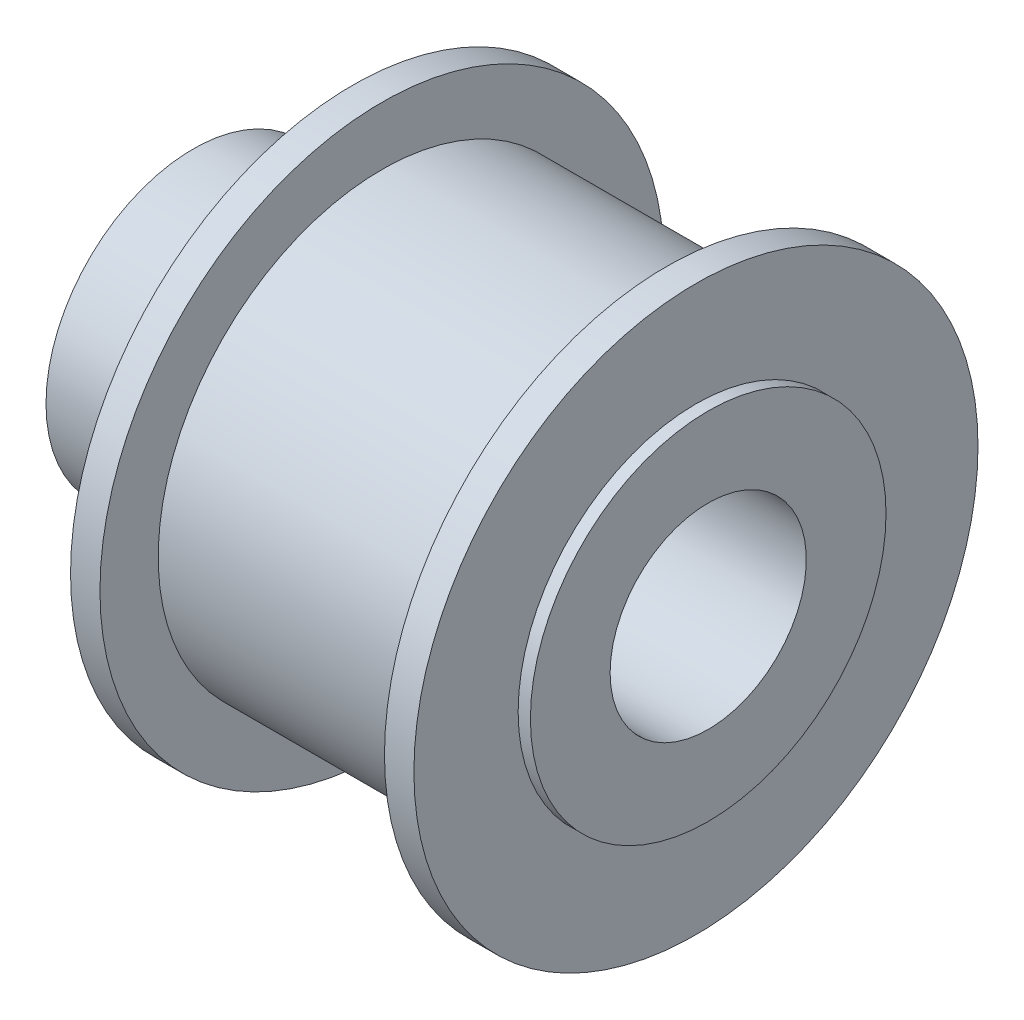
ISO-10303-21;
HEADER;
FILE_DESCRIPTION(('STEP AP214'),'2;1');
FILE_NAME('part.step','',(''),(''),'','','');
FILE_SCHEMA(('AUTOMOTIVE_DESIGN { 1 0 10303 214 1 1 1 1 }'));
ENDSEC;
DATA;
#1=APPLICATION_CONTEXT('core data for automotive mechanical design processes');
#2=APPLICATION_PROTOCOL_DEFINITION('international standard','automotive_design',2000,#1);
#3=PRODUCT_CONTEXT('',#1,'mechanical');
#4=PRODUCT('Part','Part','',(#3));
#5=PRODUCT_RELATED_PRODUCT_CATEGORY('part','',(#4));
#6=PRODUCT_DEFINITION_FORMATION('','',#4);
#7=PRODUCT_DEFINITION_CONTEXT('part definition',#1,'design');
#8=PRODUCT_DEFINITION('design','',#6,#7);
#9=PRODUCT_DEFINITION_SHAPE('','',#8);
#10=(LENGTH_UNIT() NAMED_UNIT(*) SI_UNIT(.MILLI.,.METRE.));
#11=(NAMED_UNIT(*) PLANE_ANGLE_UNIT() SI_UNIT($,.RADIAN.));
#12=(NAMED_UNIT(*) SI_UNIT($,.STERADIAN.) SOLID_ANGLE_UNIT());
#13=UNCERTAINTY_MEASURE_WITH_UNIT(LENGTH_MEASURE(1.E-05),#10,'distance_accuracy_value','');
#14=(GEOMETRIC_REPRESENTATION_CONTEXT(3) GLOBAL_UNCERTAINTY_ASSIGNED_CONTEXT((#13)) GLOBAL_UNIT_ASSIGNED_CONTEXT((#10,
#11,#12)) REPRESENTATION_CONTEXT('',''));
#15=CARTESIAN_POINT('',(0.,0.,0.));
#16=DIRECTION('',(0.,0.,1.));
#17=DIRECTION('',(1.,0.,0.));
#18=AXIS2_PLACEMENT_3D('',#15,#16,#17);
#19=CARTESIAN_POINT('',(6.,0.,0.));
#20=DIRECTION('',(-1.,0.,0.));
#21=DIRECTION('',(0.,0.,1.));
#22=AXIS2_PLACEMENT_3D('',#19,#20,#21);
#23=CYLINDRICAL_SURFACE('',#22,6.);
#24=CARTESIAN_POINT('',(2.25000000000001,0.,-6.));
#25=CARTESIAN_POINT('',(2.25000247746924,-0.06940904170166,-5.99999871526651));
#26=CARTESIAN_POINT('',(2.25580066571876,-0.138848789520874,-5.99878328775043));
#27=CARTESIAN_POINT('',(2.27881934953286,-0.275761316266991,-5.99405200990679));
#28=CARTESIAN_POINT('',(2.29604852303694,-0.343232560128309,-5.99053441189248));
#29=CARTESIAN_POINT('',(2.34137045492183,-0.474209132291338,-5.98159109196201));
#30=CARTESIAN_POINT('',(2.3694523959989,-0.53771833670918,-5.97616727052645));
#31=CARTESIAN_POINT('',(2.43564960885619,-0.659120328605952,-5.96399927809858));
#32=CARTESIAN_POINT('',(2.47376443115584,-0.71701336753432,-5.95725516625975));
#33=CARTESIAN_POINT('',(2.55953634019065,-0.826390324308829,-5.9430770002465));
#34=CARTESIAN_POINT('',(2.60731200123509,-0.877780244162677,-5.93563505848531));
#35=CARTESIAN_POINT('',(2.71079465919512,-0.971877776769383,-5.92095657692448));
#36=CARTESIAN_POINT('',(2.76650231187227,-1.01458467096098,-5.91372005416683));
#37=CARTESIAN_POINT('',(2.88495196876617,-1.09051031677216,-5.90019442595308));
#38=CARTESIAN_POINT('',(2.94775838450275,-1.1236305468065,-5.89391545174828));
#39=CARTESIAN_POINT('',(3.07819745177276,-1.17881119348063,-5.8831284065002));
#40=CARTESIAN_POINT('',(3.14582958244254,-1.2008728016764,-5.87862014467568));
#41=CARTESIAN_POINT('',(3.28298523741564,-1.23300240133736,-5.87196500986123));
#42=CARTESIAN_POINT('',(3.35246835933477,-1.24323597696798,-5.86978556855865));
#43=CARTESIAN_POINT('',(3.49219684286263,-1.25193357655613,-5.86793690716491));
#44=CARTESIAN_POINT('',(3.5624421188653,-1.25039890894686,-5.86826740800981));
#45=CARTESIAN_POINT('',(3.70048102797518,-1.23573719037196,-5.87137174319175));
#46=CARTESIAN_POINT('',(3.76829597966121,-1.22280105232719,-5.87410533679901));
#47=CARTESIAN_POINT('',(3.90077150964492,-1.18600543529944,-5.88164437615942));
#48=CARTESIAN_POINT('',(3.96543192560633,-1.16214539481381,-5.88644992841317));
#49=CARTESIAN_POINT('',(4.09030722841598,-1.10400003213927,-5.89763191464102));
#50=CARTESIAN_POINT('',(4.15048629652707,-1.06964002534236,-5.90401953785586));
#51=CARTESIAN_POINT('',(4.26429574426815,-0.991522699274807,-5.91763890010721));
#52=CARTESIAN_POINT('',(4.31792530883597,-0.947764212262578,-5.92487074398537));
#53=CARTESIAN_POINT('',(4.41821396108036,-0.851074921546774,-5.93953730929909));
#54=CARTESIAN_POINT('',(4.46471616889701,-0.797981433412074,-5.94697323199473));
#55=CARTESIAN_POINT('',(4.54818044222896,-0.68466728861179,-5.96108088143001));
#56=CARTESIAN_POINT('',(4.58514236459839,-0.624446525025759,-5.96775259670236));
#57=CARTESIAN_POINT('',(4.64851008153594,-0.498405541235473,-5.97959870942815));
#58=CARTESIAN_POINT('',(4.67489680456711,-0.432575461926495,-5.98477039710258));
#59=CARTESIAN_POINT('',(4.71619170483548,-0.297284620972151,-5.99301338211281));
#60=CARTESIAN_POINT('',(4.73110139323139,-0.227824338595087,-5.99608495596053));
#61=CARTESIAN_POINT('',(4.74879425206787,-0.0885918657008335,-5.99974275215455));
#62=CARTESIAN_POINT('',(4.75179194149424,-0.0188480555261776,-6.00037293537579));
#63=CARTESIAN_POINT('',(4.74615505003089,0.120143798757714,-5.99919952252774));
#64=CARTESIAN_POINT('',(4.73752118139839,0.189391872962257,-5.99739607548153));
#65=CARTESIAN_POINT('',(4.70904434653046,0.324726367119811,-5.99158564979184));
#66=CARTESIAN_POINT('',(4.68931251461652,0.390837192894204,-5.98760052868077));
#67=CARTESIAN_POINT('',(4.63932213957858,0.518811446661328,-5.97787227242394));
#68=CARTESIAN_POINT('',(4.60906275913401,0.580674536336771,-5.97212899744579));
#69=CARTESIAN_POINT('',(4.53841962176243,0.699294306943489,-5.95941241490714));
#70=CARTESIAN_POINT('',(4.49790807043093,0.755973219469828,-5.9524239381233));
#71=CARTESIAN_POINT('',(4.40808043692372,0.861805445886513,-5.93802568299709));
#72=CARTESIAN_POINT('',(4.35876332448105,0.910957877913279,-5.93061585542511));
#73=CARTESIAN_POINT('',(4.25174442300029,1.00117864865179,-5.91606024531377));
#74=CARTESIAN_POINT('',(4.19391696804471,1.04209914600204,-5.90892089307501));
#75=CARTESIAN_POINT('',(4.07208371578621,1.11364719079242,-5.89585601015805));
#76=CARTESIAN_POINT('',(4.00807817586089,1.14427516677863,-5.88993042894651));
#77=CARTESIAN_POINT('',(3.87603880370176,1.19417246443921,-5.88001700708041));
#78=CARTESIAN_POINT('',(3.80802896283416,1.2135030982803,-5.87601872784687));
#79=CARTESIAN_POINT('',(3.66963344950774,1.24044038523406,-5.87039184709697));
#80=CARTESIAN_POINT('',(3.59924811838056,1.2480487154444,-5.86876290660367));
#81=CARTESIAN_POINT('',(3.45958659900035,1.2512592648761,-5.86807907308506));
#82=CARTESIAN_POINT('',(3.39031592977795,1.24709542622724,-5.86897402321502));
#83=CARTESIAN_POINT('',(3.25348599107978,1.2273990531403,-5.87312447254928));
#84=CARTESIAN_POINT('',(3.1859267051839,1.21186662782265,-5.87637994909626));
#85=CARTESIAN_POINT('',(3.05460222810934,1.16998217768584,-5.88486132447716));
#86=CARTESIAN_POINT('',(2.99082675351308,1.1436611756842,-5.8900815700793));
#87=CARTESIAN_POINT('',(2.86856122397334,1.08097457299756,-5.90190705738738));
#88=CARTESIAN_POINT('',(2.81007166036688,1.04460803983029,-5.9085124276546));
#89=CARTESIAN_POINT('',(2.69887837292056,0.962073695342401,-5.92251579551146));
#90=CARTESIAN_POINT('',(2.64630087543502,0.915737890418216,-5.92992613868404));
#91=CARTESIAN_POINT('',(2.54959050677365,0.814924438115326,-5.94461839583213));
#92=CARTESIAN_POINT('',(2.50545958244852,0.760444918832959,-5.9519002798488));
#93=CARTESIAN_POINT('',(2.42641142681595,0.644134427507695,-5.96561444547637));
#94=CARTESIAN_POINT('',(2.39160632011372,0.582225921521341,-5.97203596073244));
#95=CARTESIAN_POINT('',(2.33294977156999,0.453319843998448,-5.98319908494092));
#96=CARTESIAN_POINT('',(2.30908875281814,0.386326781907239,-5.98794216182101));
#97=CARTESIAN_POINT('',(2.27745972171159,0.266015292900102,-5.99432499781443));
#98=CARTESIAN_POINT('',(2.26718123679116,0.213367593727926,-5.99644035661395));
#99=CARTESIAN_POINT('',(2.25345054572268,0.107152674176536,-5.99927832789758));
#100=CARTESIAN_POINT('',(2.24999808733282,0.0535854878488711,-6.00000099184586));
#101=CARTESIAN_POINT('',(2.25000000000001,0.,-6.));
#102=B_SPLINE_CURVE_WITH_KNOTS('',3,(#24,#25,#26,#27,#28,#29,#30,#31,#32,#33,#34,#35,#36,#37,
#38,#39,#40,#41,#42,#43,#44,#45,#46,#47,#48,#49,#50,#51,#52,#53,#54,#55,#56,#57,#58,#59,#60,#61,
#62,#63,#64,#65,#66,#67,#68,#69,#70,#71,#72,#73,#74,#75,#76,#77,#78,#79,#80,#81,#82,#83,#84,#85,
#86,#87,#88,#89,#90,#91,#92,#93,#94,#95,#96,#97,#98,#99,#100,#101),.UNSPECIFIED.,.T.,.F.,(4,2,2,
2,2,2,2,2,2,2,2,2,2,2,2,2,2,2,2,2,2,2,2,2,2,2,2,2,2,2,2,2,2,2,2,2,2,2,4),(0.,0.208031045103181,
0.416220199906221,0.624202378825437,0.832175241572982,1.04287526388122,1.25359271551785,
1.46640449178547,1.67919333285489,1.88896575169853,2.09871484767163,2.30501712129057,
2.51133000030278,2.71914592416747,2.92698768368032,3.13889526355463,3.35080602278215,
3.56309724499659,3.77536051045768,3.98378339407672,4.19219351552274,4.39855286632617,
4.60492863390929,4.81401583995732,5.02312752564569,5.23571263829332,5.44828889851304,
5.6597005009502,5.87108185414179,6.07829223291033,6.28550062281355,6.49211731393249,
6.69875319081474,6.90919024830302,7.11967575117363,7.33258864398249,7.54531486464966,
7.70592588477273,7.86653096973384),.UNSPECIFIED.);
#103=CARTESIAN_POINT('',(2.25000000000001,0.,-6.));
#104=VERTEX_POINT('',#103);
#105=EDGE_CURVE('E66',#104,#104,#102,.T.);
#106=ORIENTED_EDGE('',*,*,#105,.T.);
#107=EDGE_LOOP('',(#106));
#108=FACE_BOUND('',#107,.T.);
#109=CARTESIAN_POINT('',(6.,0.,0.));
#110=DIRECTION('',(1.,0.,0.));
#111=DIRECTION('',(0.,0.,-1.));
#112=AXIS2_PLACEMENT_3D('',#109,#110,#111);
#113=CIRCLE('',#112,6.);
#114=CARTESIAN_POINT('',(6.,0.,-6.));
#115=VERTEX_POINT('',#114);
#116=EDGE_CURVE('E140',#115,#115,#113,.T.);
#117=ORIENTED_EDGE('',*,*,#116,.F.);
#118=EDGE_LOOP('',(#117));
#119=FACE_BOUND('',#118,.T.);
#120=CARTESIAN_POINT('',(0.,0.,0.));
#121=DIRECTION('',(1.,0.,0.));
#122=DIRECTION('',(0.,0.,-1.));
#123=AXIS2_PLACEMENT_3D('',#120,#121,#122);
#124=CIRCLE('',#123,6.);
#125=CARTESIAN_POINT('',(0.,0.,-6.));
#126=VERTEX_POINT('',#125);
#127=EDGE_CURVE('E84',#126,#126,#124,.T.);
#128=ORIENTED_EDGE('',*,*,#127,.T.);
#129=EDGE_LOOP('',(#128));
#130=FACE_BOUND('',#129,.T.);
#131=ADVANCED_FACE('F52',(#108,#119,#130),#23,.T.);
#132=CARTESIAN_POINT('',(0.,0.,0.));
#133=DIRECTION('',(1.,0.,0.));
#134=DIRECTION('',(0.,0.,-1.));
#135=AXIS2_PLACEMENT_3D('',#132,#133,#134);
#136=PLANE('',#135);
#137=CARTESIAN_POINT('',(0.,0.,0.));
#138=DIRECTION('',(-1.,0.,0.));
#139=DIRECTION('',(0.,0.,1.));
#140=AXIS2_PLACEMENT_3D('',#137,#138,#139);
#141=CIRCLE('',#140,4.);
#142=CARTESIAN_POINT('',(0.,0.,4.));
#143=VERTEX_POINT('',#142);
#144=EDGE_CURVE('E102',#143,#143,#141,.T.);
#145=ORIENTED_EDGE('',*,*,#144,.F.);
#146=EDGE_LOOP('',(#145));
#147=FACE_BOUND('',#146,.T.);
#148=ORIENTED_EDGE('',*,*,#127,.F.);
#149=EDGE_LOOP('',(#148));
#150=FACE_BOUND('',#149,.T.);
#151=ADVANCED_FACE('F163',(#147,#150),#136,.F.);
#152=CARTESIAN_POINT('',(6.5,0.,0.));
#153=DIRECTION('',(-1.,0.,0.));
#154=DIRECTION('',(0.,0.,1.));
#155=AXIS2_PLACEMENT_3D('',#152,#153,#154);
#156=CYLINDRICAL_SURFACE('',#155,7.25);
#157=CARTESIAN_POINT('',(6.5,0.,0.));
#158=DIRECTION('',(1.,0.,0.));
#159=DIRECTION('',(0.,0.,-1.));
#160=AXIS2_PLACEMENT_3D('',#157,#158,#159);
#161=CIRCLE('',#160,7.25);
#162=CARTESIAN_POINT('',(6.5,0.,-7.25));
#163=VERTEX_POINT('',#162);
#164=EDGE_CURVE('E147',#163,#163,#161,.T.);
#165=ORIENTED_EDGE('',*,*,#164,.F.);
#166=EDGE_LOOP('',(#165));
#167=FACE_BOUND('',#166,.T.);
#168=CARTESIAN_POINT('',(6.,0.,0.));
#169=DIRECTION('',(1.,0.,0.));
#170=DIRECTION('',(0.,0.,-1.));
#171=AXIS2_PLACEMENT_3D('',#168,#169,#170);
#172=CIRCLE('',#171,7.25);
#173=CARTESIAN_POINT('',(6.,0.,-7.25));
#174=VERTEX_POINT('',#173);
#175=EDGE_CURVE('E145',#174,#174,#172,.T.);
#176=ORIENTED_EDGE('',*,*,#175,.T.);
#177=EDGE_LOOP('',(#176));
#178=FACE_BOUND('',#177,.T.);
#179=ADVANCED_FACE('F161',(#167,#178),#156,.T.);
#180=CARTESIAN_POINT('',(6.,0.,0.));
#181=DIRECTION('',(1.,0.,0.));
#182=DIRECTION('',(0.,0.,-1.));
#183=AXIS2_PLACEMENT_3D('',#180,#181,#182);
#184=PLANE('',#183);
#185=ORIENTED_EDGE('',*,*,#116,.T.);
#186=EDGE_LOOP('',(#185));
#187=FACE_BOUND('',#186,.T.);
#188=ORIENTED_EDGE('',*,*,#175,.F.);
#189=EDGE_LOOP('',(#188));
#190=FACE_BOUND('',#189,.T.);
#191=ADVANCED_FACE('F167',(#187,#190),#184,.F.);
#192=CARTESIAN_POINT('',(7.7,0.,0.));
#193=DIRECTION('',(-1.,0.,0.));
#194=DIRECTION('',(0.,0.,1.));
#195=AXIS2_PLACEMENT_3D('',#192,#193,#194);
#196=CYLINDRICAL_SURFACE('',#195,11.5);
#197=CARTESIAN_POINT('',(7.7,0.,0.));
#198=DIRECTION('',(1.,0.,0.));
#199=DIRECTION('',(0.,0.,-1.));
#200=AXIS2_PLACEMENT_3D('',#197,#198,#199);
#201=CIRCLE('',#200,11.5);
#202=CARTESIAN_POINT('',(7.7,0.,-11.5));
#203=VERTEX_POINT('',#202);
#204=EDGE_CURVE('E136',#203,#203,#201,.T.);
#205=ORIENTED_EDGE('',*,*,#204,.F.);
#206=EDGE_LOOP('',(#205));
#207=FACE_BOUND('',#206,.T.);
#208=CARTESIAN_POINT('',(6.5,0.,0.));
#209=DIRECTION('',(1.,0.,0.));
#210=DIRECTION('',(0.,0.,-1.));
#211=AXIS2_PLACEMENT_3D('',#208,#209,#210);
#212=CIRCLE('',#211,11.5);
#213=CARTESIAN_POINT('',(6.5,0.,-11.5));
#214=VERTEX_POINT('',#213);
#215=EDGE_CURVE('E132',#214,#214,#212,.T.);
#216=ORIENTED_EDGE('',*,*,#215,.T.);
#217=EDGE_LOOP('',(#216));
#218=FACE_BOUND('',#217,.T.);
#219=ADVANCED_FACE('F178',(#207,#218),#196,.T.);
#220=CARTESIAN_POINT('',(7.7,0.,0.));
#221=DIRECTION('',(1.,0.,0.));
#222=DIRECTION('',(0.,0.,-1.));
#223=AXIS2_PLACEMENT_3D('',#220,#221,#222);
#224=PLANE('',#223);
#225=CARTESIAN_POINT('',(7.7,0.,0.));
#226=DIRECTION('',(1.,0.,0.));
#227=DIRECTION('',(0.,0.,-1.));
#228=AXIS2_PLACEMENT_3D('',#225,#226,#227);
#229=CIRCLE('',#228,9.125);
#230=CARTESIAN_POINT('',(7.7,0.,-9.125));
#231=VERTEX_POINT('',#230);
#232=EDGE_CURVE('E77',#231,#231,#229,.T.);
#233=ORIENTED_EDGE('',*,*,#232,.F.);
#234=EDGE_LOOP('',(#233));
#235=FACE_BOUND('',#234,.T.);
#236=ORIENTED_EDGE('',*,*,#204,.T.);
#237=EDGE_LOOP('',(#236));
#238=FACE_BOUND('',#237,.T.);
#239=ADVANCED_FACE('F181',(#235,#238),#224,.T.);
#240=CARTESIAN_POINT('',(6.5,0.,0.));
#241=DIRECTION('',(1.,0.,0.));
#242=DIRECTION('',(0.,0.,-1.));
#243=AXIS2_PLACEMENT_3D('',#240,#241,#242);
#244=PLANE('',#243);
#245=ORIENTED_EDGE('',*,*,#164,.T.);
#246=EDGE_LOOP('',(#245));
#247=FACE_BOUND('',#246,.T.);
#248=ORIENTED_EDGE('',*,*,#215,.F.);
#249=EDGE_LOOP('',(#248));
#250=FACE_BOUND('',#249,.T.);
#251=ADVANCED_FACE('F182',(#247,#250),#244,.F.);
#252=CARTESIAN_POINT('',(19.3,0.,0.));
#253=DIRECTION('',(-1.,0.,0.));
#254=DIRECTION('',(0.,0.,1.));
#255=AXIS2_PLACEMENT_3D('',#252,#253,#254);
#256=CYLINDRICAL_SURFACE('',#255,9.125);
#257=CARTESIAN_POINT('',(12.25,0.,-9.125));
#258=CARTESIAN_POINT('',(12.2500029306228,-0.0698621847508083,-9.12499895200581));
#259=CARTESIAN_POINT('',(12.2558766296031,-0.139766603282016,-9.12418924531764));
#260=CARTESIAN_POINT('',(12.279212981677,-0.277626245752977,-9.12103706831816));
#261=CARTESIAN_POINT('',(12.2966873624436,-0.345579424492193,-9.11869304692984));
#262=CARTESIAN_POINT('',(12.3426971554111,-0.477521146631457,-9.11273600979666));
#263=CARTESIAN_POINT('',(12.371224701912,-0.541512471909119,-9.10912389662785));
#264=CARTESIAN_POINT('',(12.4385128753114,-0.663788535783269,-9.10103122295552));
#265=CARTESIAN_POINT('',(12.4772719004631,-0.722074165655115,-9.09655079841605));
#266=CARTESIAN_POINT('',(12.5641942795675,-0.831677886524417,-9.08718794591366));
#267=CARTESIAN_POINT('',(12.6124114443691,-0.882953118497697,-9.08230331479949));
#268=CARTESIAN_POINT('',(12.7167657003583,-0.976711094829986,-9.07270010075097));
#269=CARTESIAN_POINT('',(12.7729032178176,-1.01919336564998,-9.06798152677087));
#270=CARTESIAN_POINT('',(12.8917876743277,-1.09432258284321,-9.05922317784254));
#271=CARTESIAN_POINT('',(12.9545606104374,-1.12692875166916,-9.05518624687306));
#272=CARTESIAN_POINT('',(13.0847561346432,-1.18111970617782,-9.04827785043255));
#273=CARTESIAN_POINT('',(13.1521785113171,-1.20270499263415,-9.045406332008));
#274=CARTESIAN_POINT('',(13.289311283649,-1.23410984371242,-9.04117525298354));
#275=CARTESIAN_POINT('',(13.3590046985042,-1.24400227342893,-9.03980633266602));
#276=CARTESIAN_POINT('',(13.499074814989,-1.25196619102586,-9.03870692025027));
#277=CARTESIAN_POINT('',(13.5694514836271,-1.25003824685713,-9.03897634943185));
#278=CARTESIAN_POINT('',(13.7083794185614,-1.23447583369108,-9.0411146296895));
#279=CARTESIAN_POINT('',(13.7769399149971,-1.22092203256729,-9.04297245910848));
#280=CARTESIAN_POINT('',(13.9108041851719,-1.18261869991471,-9.04806100929598));
#281=CARTESIAN_POINT('',(13.9761078808469,-1.15786890016564,-9.05129176295525));
#282=CARTESIAN_POINT('',(14.1018530564061,-1.09779070889006,-9.05877449057879));
#283=CARTESIAN_POINT('',(14.162277775431,-1.06242766889827,-9.0630298002164));
#284=CARTESIAN_POINT('',(14.276365955215,-0.982151558310796,-9.07207967799647));
#285=CARTESIAN_POINT('',(14.3300290447954,-0.937237963802364,-9.07687427571574));
#286=CARTESIAN_POINT('',(14.4295385745573,-0.838690560698428,-9.08651136540663));
#287=CARTESIAN_POINT('',(14.4753162554363,-0.78498729971073,-9.09135392392792));
#288=CARTESIAN_POINT('',(14.5572187599481,-0.670623022881472,-9.10050410626522));
#289=CARTESIAN_POINT('',(14.5933435530108,-0.609961985006002,-9.1048117283871));
#290=CARTESIAN_POINT('',(14.6549164690892,-0.483348068763184,-9.11241015429395));
#291=CARTESIAN_POINT('',(14.6803598301029,-0.41739284571476,-9.11570050438622));
#292=CARTESIAN_POINT('',(14.7197906878547,-0.282090886205116,-9.12088970622943));
#293=CARTESIAN_POINT('',(14.733778829501,-0.21274434090222,-9.12278863631418));
#294=CARTESIAN_POINT('',(14.7498120023597,-0.073222256503289,-9.1249707721776));
#295=CARTESIAN_POINT('',(14.7519516653321,-0.00305778457866974,-9.12526677980015));
#296=CARTESIAN_POINT('',(14.7444775400603,0.136628823634917,-9.12424441303839));
#297=CARTESIAN_POINT('',(14.7348640537602,0.206150976379151,-9.1229260801273));
#298=CARTESIAN_POINT('',(14.7042351772175,0.342296847398637,-9.11883110039987));
#299=CARTESIAN_POINT('',(14.6832653586952,0.40893100832713,-9.11606028365655));
#300=CARTESIAN_POINT('',(14.6305667626585,0.537737314916342,-9.10937027606008));
#301=CARTESIAN_POINT('',(14.5988375543238,0.599909281784096,-9.10545103922353));
#302=CARTESIAN_POINT('',(14.5252950801917,0.718446032020606,-9.09686857828012));
#303=CARTESIAN_POINT('',(14.4834211411706,0.774772847081922,-9.09220093719798));
#304=CARTESIAN_POINT('',(14.3908630605883,0.879633007320067,-9.08265645623741));
#305=CARTESIAN_POINT('',(14.3401784958287,0.928165977921901,-9.07777960631859));
#306=CARTESIAN_POINT('',(14.2310189939167,1.01640047092897,-9.06832635321724));
#307=CARTESIAN_POINT('',(14.1724928573074,1.0560389345958,-9.06375224799343));
#308=CARTESIAN_POINT('',(14.0495577938985,1.12492236856956,-9.05546152631863));
#309=CARTESIAN_POINT('',(13.9851490044945,1.15416758154388,-9.0517448898477));
#310=CARTESIAN_POINT('',(13.8524733566251,1.20133423939035,-9.04560605310839));
#311=CARTESIAN_POINT('',(13.7842189411878,1.21929015087572,-9.04317991642835));
#312=CARTESIAN_POINT('',(13.6456280106621,1.24347894062577,-9.03988587487417));
#313=CARTESIAN_POINT('',(13.5752916138839,1.24971248372845,-9.03901788162952));
#314=CARTESIAN_POINT('',(13.4351611554181,1.25026573198211,-9.03894132091768));
#315=CARTESIAN_POINT('',(13.3653674720303,1.24468453474358,-9.03971895056535));
#316=CARTESIAN_POINT('',(13.2277206595978,1.22197773062216,-9.04281619463229));
#317=CARTESIAN_POINT('',(13.1598675293648,1.20485213080882,-9.04513580810729));
#318=CARTESIAN_POINT('',(13.0280476028951,1.15957553112042,-9.05105113378066));
#319=CARTESIAN_POINT('',(12.964078793817,1.13143029888114,-9.05464617833077));
#320=CARTESIAN_POINT('',(12.8417555375662,1.06492312348014,-9.06270825466567));
#321=CARTESIAN_POINT('',(12.7834012161268,1.02656095158808,-9.0671753059718));
#322=CARTESIAN_POINT('',(12.6734581393169,0.940344552943415,-9.07652284991891));
#323=CARTESIAN_POINT('',(12.6219274139843,0.892416647989505,-9.08140637178351));
#324=CARTESIAN_POINT('',(12.5276035808138,0.788584381395736,-9.09101051581208));
#325=CARTESIAN_POINT('',(12.484812521165,0.732678155194827,-9.09573109957568));
#326=CARTESIAN_POINT('',(12.4090121901424,0.614179583987107,-9.10450170875655));
#327=CARTESIAN_POINT('',(12.3760484350263,0.551557899702308,-9.1085485767599));
#328=CARTESIAN_POINT('',(12.3211538218773,0.421644325499514,-9.11548438707335));
#329=CARTESIAN_POINT('',(12.2992112309484,0.354357489250469,-9.11837456010711));
#330=CARTESIAN_POINT('',(12.2721095263929,0.23895246144657,-9.12199142610845));
#331=CARTESIAN_POINT('',(12.263830710586,0.191555379666212,-9.12311400991727));
#332=CARTESIAN_POINT('',(12.2527749654384,0.0961121917539034,-9.12461865385319));
#333=CARTESIAN_POINT('',(12.2499979836934,0.0480660918081733,-9.12500072103364));
#334=CARTESIAN_POINT('',(12.25,0.,-9.125));
#335=B_SPLINE_CURVE_WITH_KNOTS('',3,(#257,#258,#259,#260,#261,#262,#263,#264,#265,#266,#267,
#268,#269,#270,#271,#272,#273,#274,#275,#276,#277,#278,#279,#280,#281,#282,#283,#284,#285,#286,
#287,#288,#289,#290,#291,#292,#293,#294,#295,#296,#297,#298,#299,#300,#301,#302,#303,#304,#305,
#306,#307,#308,#309,#310,#311,#312,#313,#314,#315,#316,#317,#318,#319,#320,#321,#322,#323,#324,
#325,#326,#327,#328,#329,#330,#331,#332,#333,#334),.UNSPECIFIED.,.T.,.F.,(4,2,2,2,2,2,2,2,2,2,2,
2,2,2,2,2,2,2,2,2,2,2,2,2,2,2,2,2,2,2,2,2,2,2,2,2,2,2,4),(0.,0.209410953402168,
0.419033933197276,0.628508013384835,0.837949319652085,1.04861871138486,1.25929944562585,
1.47083856222923,1.68236806593259,1.89257233592209,2.10276650599783,2.31151390018757,
2.52026629556127,2.72970774696595,2.93916069062156,3.15035652545393,3.36155302912044,
3.5728435887957,3.78412225237348,3.99371100903,4.20329438136098,4.41204288405111,
4.62079974629508,4.83083736983333,5.04088508483696,5.25237795234938,5.46386588148442,
5.67470495489494,5.88553207013686,6.09459785634233,6.3036635145206,6.5126198944545,
6.72158095276423,6.93221833524975,7.1429050252751,7.35455289239385,7.56597496360165,
7.7100537956997,7.8541312554552),.UNSPECIFIED.);
#336=CARTESIAN_POINT('',(12.25,0.,-9.125));
#337=VERTEX_POINT('',#336);
#338=EDGE_CURVE('E10',#337,#337,#335,.T.);
#339=ORIENTED_EDGE('',*,*,#338,.T.);
#340=EDGE_LOOP('',(#339));
#341=FACE_BOUND('',#340,.T.);
#342=CARTESIAN_POINT('',(19.3,0.,0.));
#343=DIRECTION('',(1.,0.,0.));
#344=DIRECTION('',(0.,0.,-1.));
#345=AXIS2_PLACEMENT_3D('',#342,#343,#344);
#346=CIRCLE('',#345,9.125);
#347=CARTESIAN_POINT('',(19.3,0.,-9.125));
#348=VERTEX_POINT('',#347);
#349=EDGE_CURVE('E127',#348,#348,#346,.T.);
#350=ORIENTED_EDGE('',*,*,#349,.F.);
#351=EDGE_LOOP('',(#350));
#352=FACE_BOUND('',#351,.T.);
#353=ORIENTED_EDGE('',*,*,#232,.T.);
#354=EDGE_LOOP('',(#353));
#355=FACE_BOUND('',#354,.T.);
#356=ADVANCED_FACE('F187',(#341,#352,#355),#256,.T.);
#357=CARTESIAN_POINT('',(20.5,0.,0.));
#358=DIRECTION('',(-1.,0.,0.));
#359=DIRECTION('',(0.,0.,1.));
#360=AXIS2_PLACEMENT_3D('',#357,#358,#359);
#361=CYLINDRICAL_SURFACE('',#360,11.5);
#362=CARTESIAN_POINT('',(20.5,0.,0.));
#363=DIRECTION('',(1.,0.,0.));
#364=DIRECTION('',(0.,0.,-1.));
#365=AXIS2_PLACEMENT_3D('',#362,#363,#364);
#366=CIRCLE('',#365,11.5);
#367=CARTESIAN_POINT('',(20.5,0.,-11.5));
#368=VERTEX_POINT('',#367);
#369=EDGE_CURVE('E125',#368,#368,#366,.T.);
#370=ORIENTED_EDGE('',*,*,#369,.F.);
#371=EDGE_LOOP('',(#370));
#372=FACE_BOUND('',#371,.T.);
#373=CARTESIAN_POINT('',(19.3,0.,0.));
#374=DIRECTION('',(1.,0.,0.));
#375=DIRECTION('',(0.,0.,-1.));
#376=AXIS2_PLACEMENT_3D('',#373,#374,#375);
#377=CIRCLE('',#376,11.5);
#378=CARTESIAN_POINT('',(19.3,0.,-11.5));
#379=VERTEX_POINT('',#378);
#380=EDGE_CURVE('E119',#379,#379,#377,.T.);
#381=ORIENTED_EDGE('',*,*,#380,.T.);
#382=EDGE_LOOP('',(#381));
#383=FACE_BOUND('',#382,.T.);
#384=ADVANCED_FACE('F194',(#372,#383),#361,.T.);
#385=CARTESIAN_POINT('',(20.5,0.,0.));
#386=DIRECTION('',(1.,0.,0.));
#387=DIRECTION('',(0.,0.,-1.));
#388=AXIS2_PLACEMENT_3D('',#385,#386,#387);
#389=PLANE('',#388);
#390=CARTESIAN_POINT('',(20.5,0.,0.));
#391=DIRECTION('',(1.,0.,0.));
#392=DIRECTION('',(0.,0.,-1.));
#393=AXIS2_PLACEMENT_3D('',#390,#391,#392);
#394=CIRCLE('',#393,7.25);
#395=CARTESIAN_POINT('',(20.5,0.,-7.25));
#396=VERTEX_POINT('',#395);
#397=EDGE_CURVE('E73',#396,#396,#394,.T.);
#398=ORIENTED_EDGE('',*,*,#397,.F.);
#399=EDGE_LOOP('',(#398));
#400=FACE_BOUND('',#399,.T.);
#401=ORIENTED_EDGE('',*,*,#369,.T.);
#402=EDGE_LOOP('',(#401));
#403=FACE_BOUND('',#402,.T.);
#404=ADVANCED_FACE('F196',(#400,#403),#389,.T.);
#405=CARTESIAN_POINT('',(19.3,0.,0.));
#406=DIRECTION('',(1.,0.,0.));
#407=DIRECTION('',(0.,0.,-1.));
#408=AXIS2_PLACEMENT_3D('',#405,#406,#407);
#409=PLANE('',#408);
#410=ORIENTED_EDGE('',*,*,#349,.T.);
#411=EDGE_LOOP('',(#410));
#412=FACE_BOUND('',#411,.T.);
#413=ORIENTED_EDGE('',*,*,#380,.F.);
#414=EDGE_LOOP('',(#413));
#415=FACE_BOUND('',#414,.T.);
#416=ADVANCED_FACE('F197',(#412,#415),#409,.F.);
#417=CARTESIAN_POINT('',(21.,0.,0.));
#418=DIRECTION('',(-1.,0.,0.));
#419=DIRECTION('',(0.,0.,1.));
#420=AXIS2_PLACEMENT_3D('',#417,#418,#419);
#421=CYLINDRICAL_SURFACE('',#420,7.25);
#422=CARTESIAN_POINT('',(21.,0.,0.));
#423=DIRECTION('',(1.,0.,0.));
#424=DIRECTION('',(0.,0.,-1.));
#425=AXIS2_PLACEMENT_3D('',#422,#423,#424);
#426=CIRCLE('',#425,7.25);
#427=CARTESIAN_POINT('',(21.,0.,-7.25));
#428=VERTEX_POINT('',#427);
#429=EDGE_CURVE('E112',#428,#428,#426,.T.);
#430=ORIENTED_EDGE('',*,*,#429,.F.);
#431=EDGE_LOOP('',(#430));
#432=FACE_BOUND('',#431,.T.);
#433=ORIENTED_EDGE('',*,*,#397,.T.);
#434=EDGE_LOOP('',(#433));
#435=FACE_BOUND('',#434,.T.);
#436=ADVANCED_FACE('F203',(#432,#435),#421,.T.);
#437=CARTESIAN_POINT('',(21.,0.,0.));
#438=DIRECTION('',(1.,0.,0.));
#439=DIRECTION('',(0.,0.,-1.));
#440=AXIS2_PLACEMENT_3D('',#437,#438,#439);
#441=PLANE('',#440);
#442=CARTESIAN_POINT('',(21.,0.,0.));
#443=DIRECTION('',(-1.,0.,0.));
#444=DIRECTION('',(0.,0.,1.));
#445=AXIS2_PLACEMENT_3D('',#442,#443,#444);
#446=CIRCLE('',#445,4.);
#447=CARTESIAN_POINT('',(21.,0.,4.));
#448=VERTEX_POINT('',#447);
#449=EDGE_CURVE('E109',#448,#448,#446,.T.);
#450=ORIENTED_EDGE('',*,*,#449,.T.);
#451=EDGE_LOOP('',(#450));
#452=FACE_BOUND('',#451,.T.);
#453=ORIENTED_EDGE('',*,*,#429,.T.);
#454=EDGE_LOOP('',(#453));
#455=FACE_BOUND('',#454,.T.);
#456=ADVANCED_FACE('F207',(#452,#455),#441,.T.);
#457=CARTESIAN_POINT('',(21.,0.,0.));
#458=DIRECTION('',(-1.,0.,0.));
#459=DIRECTION('',(0.,0.,1.));
#460=AXIS2_PLACEMENT_3D('',#457,#458,#459);
#461=CYLINDRICAL_SURFACE('',#460,4.);
#462=CARTESIAN_POINT('',(12.25,0.,-4.));
#463=CARTESIAN_POINT('',(12.2500004465876,0.0684391851745461,-3.99999965877989));
#464=CARTESIAN_POINT('',(12.2556392269445,0.136883052502858,-3.99822694984841));
#465=CARTESIAN_POINT('',(12.2779862415392,0.271769209588447,-3.99132894088807));
#466=CARTESIAN_POINT('',(12.2946969813644,0.338211042725905,-3.9862028819986));
#467=CARTESIAN_POINT('',(12.3385693711957,0.467128543650803,-3.97315815697909));
#468=CARTESIAN_POINT('',(12.365714844653,0.5296101769858,-3.96524381499025));
#469=CARTESIAN_POINT('',(12.4296173176783,0.649134802346456,-3.94743969161093));
#470=CARTESIAN_POINT('',(12.4663758317806,0.70617693544488,-3.93754959899905));
#471=CARTESIAN_POINT('',(12.5496559920174,0.814965334952275,-3.91650213740283));
#472=CARTESIAN_POINT('',(12.5964208850611,0.866520028156654,-3.90531715926989));
#473=CARTESIAN_POINT('',(12.6978683924136,0.961197382036987,-3.88310046374209));
#474=CARTESIAN_POINT('',(12.7525524774946,1.00431847289869,-3.87206877523457));
#475=CARTESIAN_POINT('',(12.8699445638081,1.08194336483113,-3.85111144698172));
#476=CARTESIAN_POINT('',(12.9328174775272,1.11620784150128,-3.84121988301796));
#477=CARTESIAN_POINT('',(13.0637923149819,1.17359741076671,-3.82407801799234));
#478=CARTESIAN_POINT('',(13.1318928557939,1.19672543771944,-3.81682702128689));
#479=CARTESIAN_POINT('',(13.2692280774521,1.23048459930033,-3.80607606984501));
#480=CARTESIAN_POINT('',(13.3383668436389,1.24147110007864,-3.80246972929509));
#481=CARTESIAN_POINT('',(13.4775931189119,1.25174555036987,-3.79910055140951));
#482=CARTESIAN_POINT('',(13.5476803708217,1.25103660995771,-3.79933669227334));
#483=CARTESIAN_POINT('',(13.683874460269,1.23821824732739,-3.80353189075438));
#484=CARTESIAN_POINT('',(13.7500291258616,1.22656057869382,-3.80734341745949));
#485=CARTESIAN_POINT('',(13.8793921565373,1.19290813355625,-3.81802025652489));
#486=CARTESIAN_POINT('',(13.9426002077088,1.1709122584455,-3.82488589343115));
#487=CARTESIAN_POINT('',(14.0653519444326,1.11688874681277,-3.84101044014297));
#488=CARTESIAN_POINT('',(14.124828610692,1.08471925662081,-3.85030284660825));
#489=CARTESIAN_POINT('',(14.2376877678791,1.01136020737848,-3.8702185658007));
#490=CARTESIAN_POINT('',(14.2910686702537,0.970168305215766,-3.88084222394551));
#491=CARTESIAN_POINT('',(14.392774943417,0.877716954182118,-3.90281527800493));
#492=CARTESIAN_POINT('',(14.4407595577797,0.826084570592812,-3.91417569605696));
#493=CARTESIAN_POINT('',(14.5274718935797,0.715364408095526,-3.9359157075958));
#494=CARTESIAN_POINT('',(14.5661989292192,0.656276077349016,-3.94629522838372));
#495=CARTESIAN_POINT('',(14.6335276886013,0.53166461046545,-3.96501294890191));
#496=CARTESIAN_POINT('',(14.662048135464,0.466094906919276,-3.97333460648208));
#497=CARTESIAN_POINT('',(14.7075530008516,0.330767977782642,-3.98687955828554));
#498=CARTESIAN_POINT('',(14.7245409222384,0.261012030724607,-3.99210379325151));
#499=CARTESIAN_POINT('',(14.745918042579,0.122185157290344,-3.99871389395014));
#500=CARTESIAN_POINT('',(14.7507685435935,0.0531918487888422,-4.00024022895439));
#501=CARTESIAN_POINT('',(14.7490337733627,-0.0846303057325841,-3.99969799730981));
#502=CARTESIAN_POINT('',(14.7424501726774,-0.153459174306505,-3.99762995581125));
#503=CARTESIAN_POINT('',(14.7184044073936,-0.28721933297585,-3.99022363769772));
#504=CARTESIAN_POINT('',(14.7012167323875,-0.352204978420946,-3.98496793110725));
#505=CARTESIAN_POINT('',(14.6567856476333,-0.478351928861363,-3.97180121379252));
#506=CARTESIAN_POINT('',(14.6295409959751,-0.539512760449013,-3.96388987514204));
#507=CARTESIAN_POINT('',(14.5650267834512,-0.657932406672227,-3.94598542759568));
#508=CARTESIAN_POINT('',(14.5275290125028,-0.71505973978795,-3.9359462681821));
#509=CARTESIAN_POINT('',(14.443846789883,-0.822365850960089,-3.91493410002887));
#510=CARTESIAN_POINT('',(14.3976599822569,-0.87254273804333,-3.90396083845862));
#511=CARTESIAN_POINT('',(14.2957411099463,-0.966587462919651,-3.88176994885248));
#512=CARTESIAN_POINT('',(14.2397033362547,-1.01012652339773,-3.87055986714446));
#513=CARTESIAN_POINT('',(14.1208733836293,-1.08721250244908,-3.84961947087602));
#514=CARTESIAN_POINT('',(14.0580813119956,-1.12075957972523,-3.839889132814));
#515=CARTESIAN_POINT('',(13.9276548271141,-1.1767008348114,-3.82311782360754));
#516=CARTESIAN_POINT('',(13.8600403504953,-1.19913819558885,-3.81606646468027));
#517=CARTESIAN_POINT('',(13.7217275066762,-1.23222894320963,-3.80551170941212));
#518=CARTESIAN_POINT('',(13.6510303236287,-1.24288681414609,-3.80200696302675));
#519=CARTESIAN_POINT('',(13.5119959124458,-1.2517940615754,-3.79908292712495));
#520=CARTESIAN_POINT('',(13.4436965461871,-1.25058279621956,-3.79948604683077));
#521=CARTESIAN_POINT('',(13.3083254150808,-1.23708818129473,-3.80390090472383));
#522=CARTESIAN_POINT('',(13.241253593116,-1.22480534822559,-3.80791247457319));
#523=CARTESIAN_POINT('',(13.1112059603982,-1.18987729913377,-3.81896814158112));
#524=CARTESIAN_POINT('',(13.048184558904,-1.16738642405943,-3.82596698183475));
#525=CARTESIAN_POINT('',(12.9267595864687,-1.11280227335063,-3.84219704261348));
#526=CARTESIAN_POINT('',(12.8683569579223,-1.08070704444254,-3.85142871716522));
#527=CARTESIAN_POINT('',(12.7553540295594,-1.00635675013475,-3.8715348703158));
#528=CARTESIAN_POINT('',(12.7009918704996,-0.96375333524127,-3.88245948922441));
#529=CARTESIAN_POINT('',(12.6000136718882,-0.870208996404845,-3.90448998821726));
#530=CARTESIAN_POINT('',(12.553399711009,-0.819265842344399,-3.91559591606795));
#531=CARTESIAN_POINT('',(12.467717461637,-0.708486662823328,-3.93717271952329));
#532=CARTESIAN_POINT('',(12.42894526355,-0.648414574487376,-3.94761101730634));
#533=CARTESIAN_POINT('',(12.3621010848606,-0.52227913801365,-3.96626769296917));
#534=CARTESIAN_POINT('',(12.3340248978582,-0.456218157795446,-3.97448694315832));
#535=CARTESIAN_POINT('',(12.2914086323915,-0.325747635373975,-3.98720650733461));
#536=CARTESIAN_POINT('',(12.2759251326947,-0.261670337112544,-3.99196240806139));
#537=CARTESIAN_POINT('',(12.2552216400323,-0.131729895440246,-3.99835900340486));
#538=CARTESIAN_POINT('',(12.249999570196,-0.0658671161396741,-4.00000032839644));
#539=CARTESIAN_POINT('',(12.25,0.,-4.));
#540=B_SPLINE_CURVE_WITH_KNOTS('',3,(#462,#463,#464,#465,#466,#467,#468,#469,#470,#471,#472,
#473,#474,#475,#476,#477,#478,#479,#480,#481,#482,#483,#484,#485,#486,#487,#488,#489,#490,#491,
#492,#493,#494,#495,#496,#497,#498,#499,#500,#501,#502,#503,#504,#505,#506,#507,#508,#509,#510,
#511,#512,#513,#514,#515,#516,#517,#518,#519,#520,#521,#522,#523,#524,#525,#526,#527,#528,#529,
#530,#531,#532,#533,#534,#535,#536,#537,#538,#539),.UNSPECIFIED.,.T.,.F.,(4,2,2,2,2,2,2,2,2,2,2,
2,2,2,2,2,2,2,2,2,2,2,2,2,2,2,2,2,2,2,2,2,2,2,2,2,2,2,4),(0.,0.205075449432509,
0.410197323349064,0.615002479202432,0.819839921558386,1.03037822195158,1.24095567431275,
1.45673771247493,1.67246286279526,1.88169150167209,2.09086450295137,2.29176917422168,
2.49269519979061,2.69655642720544,2.90047066010357,3.11366747279598,3.32688007413301,
3.54175460689768,3.75656384494552,3.96307568548235,4.1695573564936,4.37090626722869,
4.57228005034497,4.7785632473834,4.98490245709256,5.19941778713137,5.41392970983709,
5.62760115751028,5.84119123892427,6.0451220347605,6.24904331751081,6.44997913396667,
6.6509558433017,6.85979514006357,7.06869037373336,7.28440668126408,7.50003806666333,
7.69744636651536,7.89481470763043),.UNSPECIFIED.);
#541=CARTESIAN_POINT('',(12.25,0.,-4.));
#542=VERTEX_POINT('',#541);
#543=EDGE_CURVE('E106',#542,#542,#540,.T.);
#544=ORIENTED_EDGE('',*,*,#543,.T.);
#545=EDGE_LOOP('',(#544));
#546=FACE_BOUND('',#545,.T.);
#547=CARTESIAN_POINT('',(2.25000000000001,0.,-4.));
#548=CARTESIAN_POINT('',(2.25000044658759,0.0684391851745459,-3.99999965877989));
#549=CARTESIAN_POINT('',(2.25563922694447,0.136883052502858,-3.99822694984841));
#550=CARTESIAN_POINT('',(2.27798624153925,0.271769209588446,-3.99132894088807));
#551=CARTESIAN_POINT('',(2.29469698136437,0.338211042725904,-3.9862028819986));
#552=CARTESIAN_POINT('',(2.33856937119575,0.467128543650802,-3.97315815697909));
#553=CARTESIAN_POINT('',(2.36571484465298,0.529610176985799,-3.96524381499025));
#554=CARTESIAN_POINT('',(2.42961731767834,0.649134802346454,-3.94743969161093));
#555=CARTESIAN_POINT('',(2.4663758317806,0.706176935444878,-3.93754959899905));
#556=CARTESIAN_POINT('',(2.54965599201737,0.814965334952273,-3.91650213740283));
#557=CARTESIAN_POINT('',(2.59642088506108,0.866520028156651,-3.90531715926989));
#558=CARTESIAN_POINT('',(2.69786839241356,0.961197382036984,-3.88310046374209));
#559=CARTESIAN_POINT('',(2.75255247749456,1.00431847289869,-3.87206877523457));
#560=CARTESIAN_POINT('',(2.86994456380809,1.08194336483112,-3.85111144698172));
#561=CARTESIAN_POINT('',(2.93281747752723,1.11620784150128,-3.84121988301796));
#562=CARTESIAN_POINT('',(3.06379231498188,1.1735974107667,-3.82407801799235));
#563=CARTESIAN_POINT('',(3.13189285579394,1.19672543771943,-3.81682702128689));
#564=CARTESIAN_POINT('',(3.26922807745207,1.23048459930032,-3.80607606984501));
#565=CARTESIAN_POINT('',(3.33836684363885,1.24147110007863,-3.80246972929509));
#566=CARTESIAN_POINT('',(3.47759311891189,1.25174555036987,-3.79910055140951));
#567=CARTESIAN_POINT('',(3.54768037082166,1.25103660995771,-3.79933669227335));
#568=CARTESIAN_POINT('',(3.68387446026898,1.23821824732738,-3.80353189075438));
#569=CARTESIAN_POINT('',(3.75002912586156,1.22656057869382,-3.80734341745949));
#570=CARTESIAN_POINT('',(3.87939215653734,1.19290813355625,-3.81802025652489));
#571=CARTESIAN_POINT('',(3.9426002077088,1.17091225844549,-3.82488589343115));
#572=CARTESIAN_POINT('',(4.06535194443263,1.11688874681276,-3.84101044014297));
#573=CARTESIAN_POINT('',(4.12482861069198,1.08471925662081,-3.85030284660825));
#574=CARTESIAN_POINT('',(4.23768776787912,1.01136020737847,-3.8702185658007));
#575=CARTESIAN_POINT('',(4.29106867025371,0.970168305215763,-3.88084222394551));
#576=CARTESIAN_POINT('',(4.39277494341698,0.877716954182114,-3.90281527800493));
#577=CARTESIAN_POINT('',(4.44075955777968,0.826084570592808,-3.91417569605696));
#578=CARTESIAN_POINT('',(4.52747189357967,0.715364408095523,-3.9359157075958));
#579=CARTESIAN_POINT('',(4.5661989292192,0.656276077349013,-3.94629522838372));
#580=CARTESIAN_POINT('',(4.63352768860127,0.531664610465448,-3.96501294890191));
#581=CARTESIAN_POINT('',(4.66204813546396,0.466094906919273,-3.97333460648208));
#582=CARTESIAN_POINT('',(4.70755300085156,0.330767977782639,-3.98687955828554));
#583=CARTESIAN_POINT('',(4.72454092223838,0.261012030724604,-3.99210379325151));
#584=CARTESIAN_POINT('',(4.74591804257897,0.122185157290342,-3.99871389395014));
#585=CARTESIAN_POINT('',(4.75076854359351,0.0531918487888397,-4.00024022895439));
#586=CARTESIAN_POINT('',(4.74903377336266,-0.0846303057325859,-3.99969799730981));
#587=CARTESIAN_POINT('',(4.74245017267738,-0.153459174306506,-3.99762995581125));
#588=CARTESIAN_POINT('',(4.71840440739359,-0.28721933297585,-3.99022363769772));
#589=CARTESIAN_POINT('',(4.70121673238747,-0.352204978420945,-3.98496793110725));
#590=CARTESIAN_POINT('',(4.6567856476333,-0.478351928861362,-3.97180121379252));
#591=CARTESIAN_POINT('',(4.62954099597508,-0.539512760449012,-3.96388987514204));
#592=CARTESIAN_POINT('',(4.5650267834512,-0.657932406672227,-3.94598542759568));
#593=CARTESIAN_POINT('',(4.52752901250277,-0.71505973978795,-3.9359462681821));
#594=CARTESIAN_POINT('',(4.44384678988297,-0.822365850960089,-3.91493410002887));
#595=CARTESIAN_POINT('',(4.39765998225688,-0.872542738043329,-3.90396083845862));
#596=CARTESIAN_POINT('',(4.2957411099463,-0.966587462919649,-3.88176994885248));
#597=CARTESIAN_POINT('',(4.23970333625473,-1.01012652339773,-3.87055986714446));
#598=CARTESIAN_POINT('',(4.12087338362925,-1.08721250244908,-3.84961947087602));
#599=CARTESIAN_POINT('',(4.05808131199556,-1.12075957972523,-3.839889132814));
#600=CARTESIAN_POINT('',(3.92765482711413,-1.1767008348114,-3.82311782360754));
#601=CARTESIAN_POINT('',(3.8600403504953,-1.19913819558885,-3.81606646468027));
#602=CARTESIAN_POINT('',(3.7217275066762,-1.23222894320963,-3.80551170941213));
#603=CARTESIAN_POINT('',(3.65103032362868,-1.24288681414609,-3.80200696302675));
#604=CARTESIAN_POINT('',(3.51199591244576,-1.25179406157539,-3.79908292712495));
#605=CARTESIAN_POINT('',(3.44369654618707,-1.25058279621956,-3.79948604683077));
#606=CARTESIAN_POINT('',(3.30832541508082,-1.23708818129473,-3.80390090472383));
#607=CARTESIAN_POINT('',(3.241253593116,-1.22480534822558,-3.8079124745732));
#608=CARTESIAN_POINT('',(3.11120596039822,-1.18987729913377,-3.81896814158112));
#609=CARTESIAN_POINT('',(3.04818455890399,-1.16738642405943,-3.82596698183475));
#610=CARTESIAN_POINT('',(2.92675958646865,-1.11280227335063,-3.84219704261348));
#611=CARTESIAN_POINT('',(2.86835695792232,-1.08070704444253,-3.85142871716522));
#612=CARTESIAN_POINT('',(2.75535402955944,-1.00635675013474,-3.8715348703158));
#613=CARTESIAN_POINT('',(2.70099187049956,-0.963753335241262,-3.88245948922441));
#614=CARTESIAN_POINT('',(2.60001367188821,-0.870208996404837,-3.90448998821726));
#615=CARTESIAN_POINT('',(2.553399711009,-0.819265842344392,-3.91559591606795));
#616=CARTESIAN_POINT('',(2.46771746163702,-0.708486662823323,-3.93717271952329));
#617=CARTESIAN_POINT('',(2.42894526355004,-0.648414574487371,-3.94761101730634));
#618=CARTESIAN_POINT('',(2.36210108486057,-0.522279138013645,-3.96626769296916));
#619=CARTESIAN_POINT('',(2.33402489785818,-0.456218157795442,-3.97448694315832));
#620=CARTESIAN_POINT('',(2.29140863239154,-0.325747635373972,-3.98720650733461));
#621=CARTESIAN_POINT('',(2.27592513269467,-0.261670337112541,-3.99196240806139));
#622=CARTESIAN_POINT('',(2.2552216400323,-0.131729895440245,-3.99835900340486));
#623=CARTESIAN_POINT('',(2.24999957019601,-0.0658671161396735,-4.00000032839644));
#624=CARTESIAN_POINT('',(2.25000000000001,0.,-4.));
#625=B_SPLINE_CURVE_WITH_KNOTS('',3,(#547,#548,#549,#550,#551,#552,#553,#554,#555,#556,#557,
#558,#559,#560,#561,#562,#563,#564,#565,#566,#567,#568,#569,#570,#571,#572,#573,#574,#575,#576,
#577,#578,#579,#580,#581,#582,#583,#584,#585,#586,#587,#588,#589,#590,#591,#592,#593,#594,#595,
#596,#597,#598,#599,#600,#601,#602,#603,#604,#605,#606,#607,#608,#609,#610,#611,#612,#613,#614,
#615,#616,#617,#618,#619,#620,#621,#622,#623,#624),.UNSPECIFIED.,.T.,.F.,(4,2,2,2,2,2,2,2,2,2,2,
2,2,2,2,2,2,2,2,2,2,2,2,2,2,2,2,2,2,2,2,2,2,2,2,2,2,2,4),(0.,0.205075449432508,
0.410197323349062,0.61500247920243,0.819839921558383,1.03037822195157,1.24095567431275,
1.45673771247493,1.67246286279525,1.88169150167208,2.09086450295136,2.29176917422167,
2.49269519979061,2.69655642720543,2.90047066010356,3.11366747279597,3.326880074133,
3.54175460689767,3.7565638449455,3.96307568548234,4.16955735649359,4.37090626722868,
4.57228005034495,4.77856324738339,4.98490245709255,5.19941778713135,5.41392970983707,
5.62760115751026,5.84119123892425,6.04512203476048,6.24904331751079,6.44997913396666,
6.65095584330168,6.85979514006356,7.06869037373334,7.28440668126406,7.50003806666331,
7.69744636651534,7.8948147076304),.UNSPECIFIED.);
#626=CARTESIAN_POINT('',(2.25000000000001,0.,-4.));
#627=VERTEX_POINT('',#626);
#628=EDGE_CURVE('E97',#627,#627,#625,.T.);
#629=ORIENTED_EDGE('',*,*,#628,.T.);
#630=EDGE_LOOP('',(#629));
#631=FACE_BOUND('',#630,.T.);
#632=ORIENTED_EDGE('',*,*,#449,.F.);
#633=EDGE_LOOP('',(#632));
#634=FACE_BOUND('',#633,.T.);
#635=ORIENTED_EDGE('',*,*,#144,.T.);
#636=EDGE_LOOP('',(#635));
#637=FACE_BOUND('',#636,.T.);
#638=ADVANCED_FACE('F89',(#546,#631,#634,#637),#461,.F.);
#639=CARTESIAN_POINT('',(3.5,0.,-6.));
#640=DIRECTION('',(0.,0.,-1.));
#641=DIRECTION('',(-1.,0.,0.));
#642=AXIS2_PLACEMENT_3D('',#639,#640,#641);
#643=CYLINDRICAL_SURFACE('',#642,1.24999999999999);
#644=ORIENTED_EDGE('',*,*,#105,.F.);
#645=EDGE_LOOP('',(#644));
#646=FACE_BOUND('',#645,.T.);
#647=ORIENTED_EDGE('',*,*,#628,.F.);
#648=EDGE_LOOP('',(#647));
#649=FACE_BOUND('',#648,.T.);
#650=ADVANCED_FACE('F83',(#646,#649),#643,.F.);
#651=CARTESIAN_POINT('',(13.5,0.,-9.125));
#652=DIRECTION('',(0.,0.,-1.));
#653=DIRECTION('',(-1.,0.,0.));
#654=AXIS2_PLACEMENT_3D('',#651,#652,#653);
#655=CYLINDRICAL_SURFACE('',#654,1.24999999999999);
#656=ORIENTED_EDGE('',*,*,#338,.F.);
#657=EDGE_LOOP('',(#656));
#658=FACE_BOUND('',#657,.T.);
#659=ORIENTED_EDGE('',*,*,#543,.F.);
#660=EDGE_LOOP('',(#659));
#661=FACE_BOUND('',#660,.T.);
#662=ADVANCED_FACE('F88',(#658,#661),#655,.F.);
#663=CLOSED_SHELL('',(#131,#151,#179,#191,#219,#239,#251,#356,#384,#404,#416,#436,#456,#638,
#650,#662));
#664=MANIFOLD_SOLID_BREP('B2',#663);
#665=ADVANCED_BREP_SHAPE_REPRESENTATION('',(#18,#664),#14);
#666=SHAPE_DEFINITION_REPRESENTATION(#9,#665);
ENDSEC;
END-ISO-10303-21;
